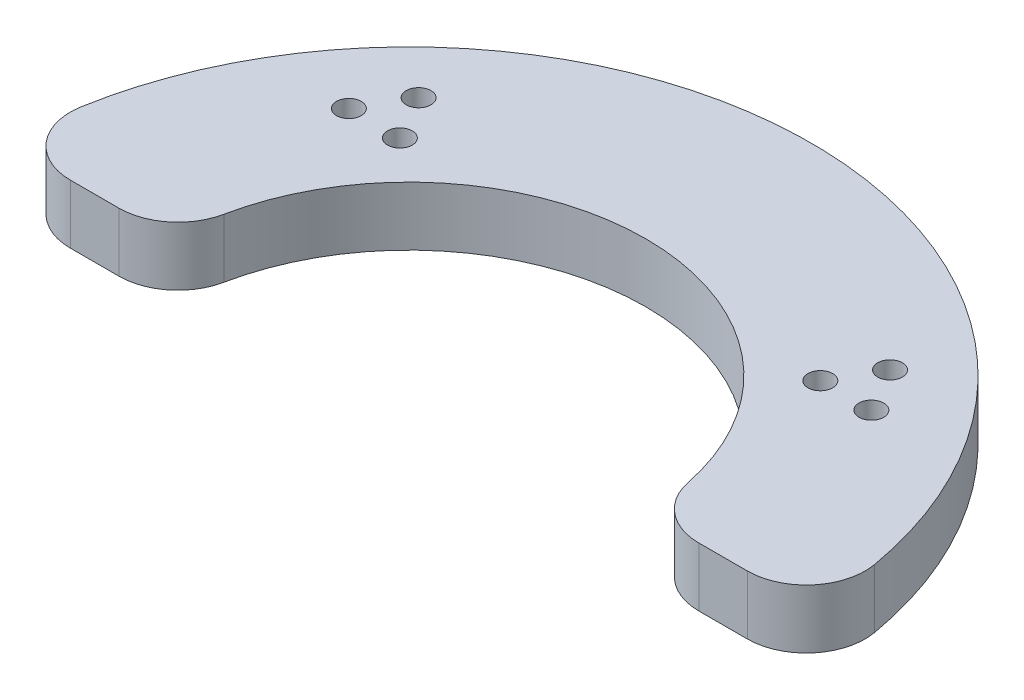
ISO-10303-21;
HEADER;
FILE_DESCRIPTION(('STEP AP214'),'2;1');
FILE_NAME('part.step','',(''),(''),'','','');
FILE_SCHEMA(('AUTOMOTIVE_DESIGN { 1 0 10303 214 1 1 1 1 }'));
ENDSEC;
DATA;
#1=APPLICATION_CONTEXT('core data for automotive mechanical design processes');
#2=APPLICATION_PROTOCOL_DEFINITION('international standard','automotive_design',2000,#1);
#3=PRODUCT_CONTEXT('',#1,'mechanical');
#4=PRODUCT('Part','Part','',(#3));
#5=PRODUCT_RELATED_PRODUCT_CATEGORY('part','',(#4));
#6=PRODUCT_DEFINITION_FORMATION('','',#4);
#7=PRODUCT_DEFINITION_CONTEXT('part definition',#1,'design');
#8=PRODUCT_DEFINITION('design','',#6,#7);
#9=PRODUCT_DEFINITION_SHAPE('','',#8);
#10=(LENGTH_UNIT() NAMED_UNIT(*) SI_UNIT(.MILLI.,.METRE.));
#11=(NAMED_UNIT(*) PLANE_ANGLE_UNIT() SI_UNIT($,.RADIAN.));
#12=(NAMED_UNIT(*) SI_UNIT($,.STERADIAN.) SOLID_ANGLE_UNIT());
#13=UNCERTAINTY_MEASURE_WITH_UNIT(LENGTH_MEASURE(1.E-05),#10,'distance_accuracy_value','');
#14=(GEOMETRIC_REPRESENTATION_CONTEXT(3) GLOBAL_UNCERTAINTY_ASSIGNED_CONTEXT((#13)) GLOBAL_UNIT_ASSIGNED_CONTEXT((#10,
#11,#12)) REPRESENTATION_CONTEXT('',''));
#15=CARTESIAN_POINT('',(0.,0.,0.));
#16=DIRECTION('',(0.,0.,1.));
#17=DIRECTION('',(1.,0.,0.));
#18=AXIS2_PLACEMENT_3D('',#15,#16,#17);
#19=CARTESIAN_POINT('',(40.,10.,-36.6532469606971));
#20=DIRECTION('',(0.,-1.,0.));
#21=DIRECTION('',(0.,0.,-1.));
#22=AXIS2_PLACEMENT_3D('',#19,#20,#21);
#23=CYLINDRICAL_SURFACE('',#22,10.05);
#24=CARTESIAN_POINT('',(40.,0.,-36.6532469606971));
#25=DIRECTION('',(0.,1.,0.));
#26=DIRECTION('',(0.,0.,1.));
#27=AXIS2_PLACEMENT_3D('',#24,#25,#26);
#28=CIRCLE('',#27,10.05);
#29=CARTESIAN_POINT('',(40.,0.,-26.6032469606971));
#30=VERTEX_POINT('',#29);
#31=EDGE_CURVE('E176',#30,#30,#28,.T.);
#32=ORIENTED_EDGE('',*,*,#31,.F.);
#33=EDGE_LOOP('',(#32));
#34=FACE_BOUND('',#33,.T.);
#35=CARTESIAN_POINT('',(40.,5.,-36.6532469606971));
#36=DIRECTION('',(0.,1.,0.));
#37=DIRECTION('',(0.,0.,1.));
#38=AXIS2_PLACEMENT_3D('',#35,#36,#37);
#39=CIRCLE('',#38,10.05);
#40=CARTESIAN_POINT('',(40.,5.,-26.6032469606971));
#41=VERTEX_POINT('',#40);
#42=EDGE_CURVE('E164',#41,#41,#39,.T.);
#43=ORIENTED_EDGE('',*,*,#42,.T.);
#44=EDGE_LOOP('',(#43));
#45=FACE_BOUND('',#44,.T.);
#46=ADVANCED_FACE('F35',(#34,#45),#23,.F.);
#47=CARTESIAN_POINT('',(-40.,10.,-36.6532469606971));
#48=DIRECTION('',(0.,-1.,0.));
#49=DIRECTION('',(0.,0.,-1.));
#50=AXIS2_PLACEMENT_3D('',#47,#48,#49);
#51=CYLINDRICAL_SURFACE('',#50,10.05);
#52=CARTESIAN_POINT('',(-40.,0.,-36.6532469606971));
#53=DIRECTION('',(0.,1.,0.));
#54=DIRECTION('',(0.,0.,-1.));
#55=AXIS2_PLACEMENT_3D('',#52,#53,#54);
#56=CIRCLE('',#55,10.05);
#57=CARTESIAN_POINT('',(-40.,0.,-46.7032469606971));
#58=VERTEX_POINT('',#57);
#59=EDGE_CURVE('E170',#58,#58,#56,.T.);
#60=ORIENTED_EDGE('',*,*,#59,.F.);
#61=EDGE_LOOP('',(#60));
#62=FACE_BOUND('',#61,.T.);
#63=CARTESIAN_POINT('',(-40.,5.,-36.6532469606971));
#64=DIRECTION('',(0.,1.,0.));
#65=DIRECTION('',(0.,0.,1.));
#66=AXIS2_PLACEMENT_3D('',#63,#64,#65);
#67=CIRCLE('',#66,10.05);
#68=CARTESIAN_POINT('',(-40.,5.,-26.6032469606971));
#69=VERTEX_POINT('',#68);
#70=EDGE_CURVE('E167',#69,#69,#67,.T.);
#71=ORIENTED_EDGE('',*,*,#70,.T.);
#72=EDGE_LOOP('',(#71));
#73=FACE_BOUND('',#72,.T.);
#74=ADVANCED_FACE('F206',(#62,#73),#51,.F.);
#75=CARTESIAN_POINT('',(0.,10.,0.));
#76=DIRECTION('',(0.,1.,0.));
#77=DIRECTION('',(0.,0.,1.));
#78=AXIS2_PLACEMENT_3D('',#75,#76,#77);
#79=PLANE('',#78);
#80=CARTESIAN_POINT('',(-40.,10.,-41.6532469606971));
#81=DIRECTION('',(0.,1.,0.));
#82=DIRECTION('',(0.,0.,1.));
#83=AXIS2_PLACEMENT_3D('',#80,#81,#82);
#84=CIRCLE('',#83,2.1);
#85=CARTESIAN_POINT('',(-40.,10.,-39.5532469606971));
#86=VERTEX_POINT('',#85);
#87=EDGE_CURVE('E294',#86,#86,#84,.F.);
#88=ORIENTED_EDGE('',*,*,#87,.T.);
#89=EDGE_LOOP('',(#88));
#90=FACE_BOUND('',#89,.T.);
#91=CARTESIAN_POINT('',(-35.6698729810778,10.,-34.1532469606971));
#92=DIRECTION('',(0.,1.,0.));
#93=DIRECTION('',(0.,0.,1.));
#94=AXIS2_PLACEMENT_3D('',#91,#92,#93);
#95=CIRCLE('',#94,2.1);
#96=CARTESIAN_POINT('',(-35.6698729810778,10.,-32.0532469606971));
#97=VERTEX_POINT('',#96);
#98=EDGE_CURVE('E291',#97,#97,#95,.F.);
#99=ORIENTED_EDGE('',*,*,#98,.T.);
#100=EDGE_LOOP('',(#99));
#101=FACE_BOUND('',#100,.T.);
#102=CARTESIAN_POINT('',(-44.3301270189222,10.,-34.1532469606971));
#103=DIRECTION('',(0.,1.,0.));
#104=DIRECTION('',(0.,0.,1.));
#105=AXIS2_PLACEMENT_3D('',#102,#103,#104);
#106=CIRCLE('',#105,2.1);
#107=CARTESIAN_POINT('',(-44.3301270189222,10.,-32.0532469606971));
#108=VERTEX_POINT('',#107);
#109=EDGE_CURVE('E288',#108,#108,#106,.F.);
#110=ORIENTED_EDGE('',*,*,#109,.T.);
#111=EDGE_LOOP('',(#110));
#112=FACE_BOUND('',#111,.T.);
#113=CARTESIAN_POINT('',(40.,10.,-41.6532469606971));
#114=DIRECTION('',(0.,1.,0.));
#115=DIRECTION('',(0.,0.,1.));
#116=AXIS2_PLACEMENT_3D('',#113,#114,#115);
#117=CIRCLE('',#116,2.1);
#118=CARTESIAN_POINT('',(40.,10.,-39.5532469606971));
#119=VERTEX_POINT('',#118);
#120=EDGE_CURVE('E153',#119,#119,#117,.T.);
#121=ORIENTED_EDGE('',*,*,#120,.F.);
#122=EDGE_LOOP('',(#121));
#123=FACE_BOUND('',#122,.T.);
#124=CARTESIAN_POINT('',(35.6698729810778,10.,-34.1532469606971));
#125=DIRECTION('',(0.,1.,0.));
#126=DIRECTION('',(0.,0.,1.));
#127=AXIS2_PLACEMENT_3D('',#124,#125,#126);
#128=CIRCLE('',#127,2.1);
#129=CARTESIAN_POINT('',(35.6698729810778,10.,-32.0532469606971));
#130=VERTEX_POINT('',#129);
#131=EDGE_CURVE('E158',#130,#130,#128,.T.);
#132=ORIENTED_EDGE('',*,*,#131,.F.);
#133=EDGE_LOOP('',(#132));
#134=FACE_BOUND('',#133,.T.);
#135=CARTESIAN_POINT('',(44.3301270189222,10.,-34.1532469606971));
#136=DIRECTION('',(0.,1.,0.));
#137=DIRECTION('',(0.,0.,1.));
#138=AXIS2_PLACEMENT_3D('',#135,#136,#137);
#139=CIRCLE('',#138,2.1);
#140=CARTESIAN_POINT('',(44.3301270189222,10.,-32.0532469606971));
#141=VERTEX_POINT('',#140);
#142=EDGE_CURVE('E301',#141,#141,#139,.T.);
#143=ORIENTED_EDGE('',*,*,#142,.F.);
#144=EDGE_LOOP('',(#143));
#145=FACE_BOUND('',#144,.T.);
#146=CARTESIAN_POINT('',(0.,10.,0.));
#147=DIRECTION('',(0.,1.,0.));
#148=DIRECTION('',(0.,0.,1.));
#149=AXIS2_PLACEMENT_3D('',#146,#147,#148);
#150=CIRCLE('',#149,68.3036681963704);
#151=CARTESIAN_POINT('',(67.2915014195323,10.,-11.715157949637));
#152=VERTEX_POINT('',#151);
#153=CARTESIAN_POINT('',(-67.2915014195323,10.,-11.715157949637));
#154=VERTEX_POINT('',#153);
#155=EDGE_CURVE('E105',#152,#154,#150,.T.);
#156=ORIENTED_EDGE('',*,*,#155,.T.);
#157=CARTESIAN_POINT('',(-57.4396877180965,10.,-10.));
#158=DIRECTION('',(0.,1.,0.));
#159=DIRECTION('',(0.,0.,1.));
#160=AXIS2_PLACEMENT_3D('',#157,#158,#159);
#161=CIRCLE('',#160,10.);
#162=CARTESIAN_POINT('',(-57.4396877180965,10.,0.));
#163=VERTEX_POINT('',#162);
#164=EDGE_CURVE('E132',#154,#163,#161,.T.);
#165=ORIENTED_EDGE('',*,*,#164,.T.);
#166=DIRECTION('',(-1.,0.,0.));
#167=VECTOR('',#166,1.);
#168=CARTESIAN_POINT('',(0.,10.,0.));
#169=LINE('',#168,#167);
#170=CARTESIAN_POINT('',(-49.1976452726271,10.,0.));
#171=VERTEX_POINT('',#170);
#172=EDGE_CURVE('E156',#171,#163,#169,.T.);
#173=ORIENTED_EDGE('',*,*,#172,.F.);
#174=CARTESIAN_POINT('',(-49.1976452726271,10.,-10.));
#175=DIRECTION('',(0.,1.,0.));
#176=DIRECTION('',(0.,0.,1.));
#177=AXIS2_PLACEMENT_3D('',#174,#175,#176);
#178=CIRCLE('',#177,10.);
#179=CARTESIAN_POINT('',(-39.3980336027803,10.,-8.00811367789197));
#180=VERTEX_POINT('',#179);
#181=EDGE_CURVE('E130',#171,#180,#178,.T.);
#182=ORIENTED_EDGE('',*,*,#181,.T.);
#183=CARTESIAN_POINT('',(0.,10.,0.));
#184=DIRECTION('',(0.,1.,0.));
#185=DIRECTION('',(0.,0.,1.));
#186=AXIS2_PLACEMENT_3D('',#183,#184,#185);
#187=CIRCLE('',#186,40.2036681963704);
#188=CARTESIAN_POINT('',(39.3980336027803,10.,-8.00811367789197));
#189=VERTEX_POINT('',#188);
#190=EDGE_CURVE('E174',#189,#180,#187,.T.);
#191=ORIENTED_EDGE('',*,*,#190,.F.);
#192=CARTESIAN_POINT('',(49.1976452726271,10.,-10.));
#193=DIRECTION('',(0.,1.,0.));
#194=DIRECTION('',(0.,0.,1.));
#195=AXIS2_PLACEMENT_3D('',#192,#193,#194);
#196=CIRCLE('',#195,10.);
#197=CARTESIAN_POINT('',(49.1976452726271,10.,0.));
#198=VERTEX_POINT('',#197);
#199=EDGE_CURVE('E111',#189,#198,#196,.T.);
#200=ORIENTED_EDGE('',*,*,#199,.T.);
#201=CARTESIAN_POINT('',(57.4396877180965,10.,0.));
#202=VERTEX_POINT('',#201);
#203=EDGE_CURVE('E107',#202,#198,#169,.T.);
#204=ORIENTED_EDGE('',*,*,#203,.F.);
#205=CARTESIAN_POINT('',(57.4396877180965,10.,-10.));
#206=DIRECTION('',(0.,1.,0.));
#207=DIRECTION('',(0.,0.,1.));
#208=AXIS2_PLACEMENT_3D('',#205,#206,#207);
#209=CIRCLE('',#208,10.);
#210=EDGE_CURVE('E102',#202,#152,#209,.T.);
#211=ORIENTED_EDGE('',*,*,#210,.T.);
#212=EDGE_LOOP('',(#156,#165,#173,#182,#191,#200,#204,#211));
#213=FACE_BOUND('',#212,.T.);
#214=ADVANCED_FACE('F104',(#90,#101,#112,#123,#134,#145,#213),#79,.T.);
#215=CARTESIAN_POINT('',(0.,0.,0.));
#216=DIRECTION('',(0.,1.,0.));
#217=DIRECTION('',(0.,0.,1.));
#218=AXIS2_PLACEMENT_3D('',#215,#216,#217);
#219=PLANE('',#218);
#220=ORIENTED_EDGE('',*,*,#31,.T.);
#221=EDGE_LOOP('',(#220));
#222=FACE_BOUND('',#221,.T.);
#223=DIRECTION('',(1.,0.,0.));
#224=VECTOR('',#223,1.);
#225=CARTESIAN_POINT('',(132.868809524425,0.,0.));
#226=LINE('',#225,#224);
#227=CARTESIAN_POINT('',(-57.4396877180965,0.,0.));
#228=VERTEX_POINT('',#227);
#229=CARTESIAN_POINT('',(-49.1976452726272,0.,0.));
#230=VERTEX_POINT('',#229);
#231=EDGE_CURVE('E152',#228,#230,#226,.T.);
#232=ORIENTED_EDGE('',*,*,#231,.F.);
#233=CARTESIAN_POINT('',(-57.4396877180965,0.,-10.));
#234=DIRECTION('',(0.,1.,0.));
#235=DIRECTION('',(0.,0.,1.));
#236=AXIS2_PLACEMENT_3D('',#233,#234,#235);
#237=CIRCLE('',#236,10.);
#238=CARTESIAN_POINT('',(-67.2915014195323,0.,-11.715157949637));
#239=VERTEX_POINT('',#238);
#240=EDGE_CURVE('E143',#228,#239,#237,.F.);
#241=ORIENTED_EDGE('',*,*,#240,.T.);
#242=CARTESIAN_POINT('',(0.,0.,0.));
#243=DIRECTION('',(0.,1.,0.));
#244=DIRECTION('',(0.,0.,1.));
#245=AXIS2_PLACEMENT_3D('',#242,#243,#244);
#246=CIRCLE('',#245,68.3036681963704);
#247=CARTESIAN_POINT('',(67.2915014195323,0.,-11.715157949637));
#248=VERTEX_POINT('',#247);
#249=EDGE_CURVE('E122',#248,#239,#246,.T.);
#250=ORIENTED_EDGE('',*,*,#249,.F.);
#251=CARTESIAN_POINT('',(57.4396877180965,0.,-10.));
#252=DIRECTION('',(0.,1.,0.));
#253=DIRECTION('',(0.,0.,1.));
#254=AXIS2_PLACEMENT_3D('',#251,#252,#253);
#255=CIRCLE('',#254,10.);
#256=CARTESIAN_POINT('',(57.4396877180965,0.,0.));
#257=VERTEX_POINT('',#256);
#258=EDGE_CURVE('E124',#248,#257,#255,.F.);
#259=ORIENTED_EDGE('',*,*,#258,.T.);
#260=CARTESIAN_POINT('',(49.1976452726271,0.,0.));
#261=VERTEX_POINT('',#260);
#262=EDGE_CURVE('E151',#261,#257,#226,.T.);
#263=ORIENTED_EDGE('',*,*,#262,.F.);
#264=CARTESIAN_POINT('',(49.1976452726271,0.,-10.));
#265=DIRECTION('',(0.,1.,0.));
#266=DIRECTION('',(0.,0.,1.));
#267=AXIS2_PLACEMENT_3D('',#264,#265,#266);
#268=CIRCLE('',#267,10.);
#269=CARTESIAN_POINT('',(39.3980336027803,0.,-8.00811367789197));
#270=VERTEX_POINT('',#269);
#271=EDGE_CURVE('E57',#261,#270,#268,.F.);
#272=ORIENTED_EDGE('',*,*,#271,.T.);
#273=CARTESIAN_POINT('',(0.,0.,0.));
#274=DIRECTION('',(0.,1.,0.));
#275=DIRECTION('',(0.,0.,1.));
#276=AXIS2_PLACEMENT_3D('',#273,#274,#275);
#277=CIRCLE('',#276,40.2036681963704);
#278=CARTESIAN_POINT('',(-39.3980336027803,0.,-8.00811367789197));
#279=VERTEX_POINT('',#278);
#280=EDGE_CURVE('E173',#270,#279,#277,.T.);
#281=ORIENTED_EDGE('',*,*,#280,.T.);
#282=CARTESIAN_POINT('',(-49.1976452726271,0.,-10.));
#283=DIRECTION('',(0.,1.,0.));
#284=DIRECTION('',(0.,0.,1.));
#285=AXIS2_PLACEMENT_3D('',#282,#283,#284);
#286=CIRCLE('',#285,10.);
#287=EDGE_CURVE('E141',#279,#230,#286,.F.);
#288=ORIENTED_EDGE('',*,*,#287,.T.);
#289=EDGE_LOOP('',(#232,#241,#250,#259,#263,#272,#281,#288));
#290=FACE_BOUND('',#289,.T.);
#291=ORIENTED_EDGE('',*,*,#59,.T.);
#292=EDGE_LOOP('',(#291));
#293=FACE_BOUND('',#292,.T.);
#294=ADVANCED_FACE('F219',(#222,#290,#293),#219,.F.);
#295=CARTESIAN_POINT('',(0.,10.,0.));
#296=DIRECTION('',(0.,-1.,0.));
#297=DIRECTION('',(0.,0.,-1.));
#298=AXIS2_PLACEMENT_3D('',#295,#296,#297);
#299=CYLINDRICAL_SURFACE('',#298,68.3036681963704);
#300=ORIENTED_EDGE('',*,*,#249,.T.);
#301=DIRECTION('',(0.,-1.,0.));
#302=VECTOR('',#301,1.);
#303=CARTESIAN_POINT('',(-67.2915014195323,10.,-11.715157949637));
#304=LINE('',#303,#302);
#305=EDGE_CURVE('E112',#239,#154,#304,.F.);
#306=ORIENTED_EDGE('',*,*,#305,.T.);
#307=ORIENTED_EDGE('',*,*,#155,.F.);
#308=DIRECTION('',(0.,-1.,0.));
#309=VECTOR('',#308,1.);
#310=CARTESIAN_POINT('',(67.2915014195323,10.,-11.715157949637));
#311=LINE('',#310,#309);
#312=EDGE_CURVE('E119',#152,#248,#311,.T.);
#313=ORIENTED_EDGE('',*,*,#312,.T.);
#314=EDGE_LOOP('',(#300,#306,#307,#313));
#315=FACE_BOUND('',#314,.T.);
#316=ADVANCED_FACE('F118',(#315),#299,.T.);
#317=CARTESIAN_POINT('',(0.,10.,0.));
#318=DIRECTION('',(0.,-1.,0.));
#319=DIRECTION('',(0.,0.,-1.));
#320=AXIS2_PLACEMENT_3D('',#317,#318,#319);
#321=CYLINDRICAL_SURFACE('',#320,40.2036681963704);
#322=ORIENTED_EDGE('',*,*,#190,.T.);
#323=DIRECTION('',(0.,-1.,0.));
#324=VECTOR('',#323,1.);
#325=CARTESIAN_POINT('',(-39.3980336027803,10.,-8.00811367789197));
#326=LINE('',#325,#324);
#327=EDGE_CURVE('E50',#180,#279,#326,.T.);
#328=ORIENTED_EDGE('',*,*,#327,.T.);
#329=ORIENTED_EDGE('',*,*,#280,.F.);
#330=DIRECTION('',(0.,-1.,0.));
#331=VECTOR('',#330,1.);
#332=CARTESIAN_POINT('',(39.3980336027803,10.,-8.00811367789197));
#333=LINE('',#332,#331);
#334=EDGE_CURVE('E145',#270,#189,#333,.F.);
#335=ORIENTED_EDGE('',*,*,#334,.T.);
#336=EDGE_LOOP('',(#322,#328,#329,#335));
#337=FACE_BOUND('',#336,.T.);
#338=ADVANCED_FACE('F195',(#337),#321,.F.);
#339=CARTESIAN_POINT('',(-40.,5.,-36.6532469606971));
#340=DIRECTION('',(0.,1.,0.));
#341=DIRECTION('',(0.,0.,1.));
#342=AXIS2_PLACEMENT_3D('',#339,#340,#341);
#343=PLANE('',#342);
#344=CARTESIAN_POINT('',(-40.,5.,-41.6532469606971));
#345=DIRECTION('',(0.,1.,0.));
#346=DIRECTION('',(0.,0.,-1.));
#347=AXIS2_PLACEMENT_3D('',#344,#345,#346);
#348=CIRCLE('',#347,2.1);
#349=CARTESIAN_POINT('',(-40.,5.,-43.7532469606971));
#350=VERTEX_POINT('',#349);
#351=EDGE_CURVE('E272',#350,#350,#348,.T.);
#352=ORIENTED_EDGE('',*,*,#351,.T.);
#353=EDGE_LOOP('',(#352));
#354=FACE_BOUND('',#353,.T.);
#355=CARTESIAN_POINT('',(-35.6698729810778,5.,-34.1532469606971));
#356=DIRECTION('',(0.,1.,0.));
#357=DIRECTION('',(0.,0.,-1.));
#358=AXIS2_PLACEMENT_3D('',#355,#356,#357);
#359=CIRCLE('',#358,2.1);
#360=CARTESIAN_POINT('',(-35.6698729810778,5.,-36.2532469606971));
#361=VERTEX_POINT('',#360);
#362=EDGE_CURVE('E276',#361,#361,#359,.T.);
#363=ORIENTED_EDGE('',*,*,#362,.T.);
#364=EDGE_LOOP('',(#363));
#365=FACE_BOUND('',#364,.T.);
#366=CARTESIAN_POINT('',(-44.3301270189222,5.,-34.1532469606971));
#367=DIRECTION('',(0.,1.,0.));
#368=DIRECTION('',(0.,0.,-1.));
#369=AXIS2_PLACEMENT_3D('',#366,#367,#368);
#370=CIRCLE('',#369,2.1);
#371=CARTESIAN_POINT('',(-44.3301270189222,5.,-36.2532469606971));
#372=VERTEX_POINT('',#371);
#373=EDGE_CURVE('E280',#372,#372,#370,.T.);
#374=ORIENTED_EDGE('',*,*,#373,.T.);
#375=EDGE_LOOP('',(#374));
#376=FACE_BOUND('',#375,.T.);
#377=ORIENTED_EDGE('',*,*,#70,.F.);
#378=EDGE_LOOP('',(#377));
#379=FACE_BOUND('',#378,.T.);
#380=ADVANCED_FACE('F262',(#354,#365,#376,#379),#343,.F.);
#381=CARTESIAN_POINT('',(40.,5.,-36.6532469606971));
#382=DIRECTION('',(0.,1.,0.));
#383=DIRECTION('',(0.,0.,1.));
#384=AXIS2_PLACEMENT_3D('',#381,#382,#383);
#385=PLANE('',#384);
#386=CARTESIAN_POINT('',(40.,5.,-41.6532469606971));
#387=DIRECTION('',(0.,-1.,0.));
#388=DIRECTION('',(0.,0.,-1.));
#389=AXIS2_PLACEMENT_3D('',#386,#387,#388);
#390=CIRCLE('',#389,2.1);
#391=CARTESIAN_POINT('',(40.,5.,-43.7532469606971));
#392=VERTEX_POINT('',#391);
#393=EDGE_CURVE('E298',#392,#392,#390,.T.);
#394=ORIENTED_EDGE('',*,*,#393,.F.);
#395=EDGE_LOOP('',(#394));
#396=FACE_BOUND('',#395,.T.);
#397=CARTESIAN_POINT('',(35.6698729810778,5.,-34.1532469606971));
#398=DIRECTION('',(0.,-1.,0.));
#399=DIRECTION('',(0.,0.,-1.));
#400=AXIS2_PLACEMENT_3D('',#397,#398,#399);
#401=CIRCLE('',#400,2.1);
#402=CARTESIAN_POINT('',(35.6698729810778,5.,-36.2532469606971));
#403=VERTEX_POINT('',#402);
#404=EDGE_CURVE('E302',#403,#403,#401,.T.);
#405=ORIENTED_EDGE('',*,*,#404,.F.);
#406=EDGE_LOOP('',(#405));
#407=FACE_BOUND('',#406,.T.);
#408=CARTESIAN_POINT('',(44.3301270189222,5.,-34.1532469606971));
#409=DIRECTION('',(0.,-1.,0.));
#410=DIRECTION('',(0.,0.,-1.));
#411=AXIS2_PLACEMENT_3D('',#408,#409,#410);
#412=CIRCLE('',#411,2.1);
#413=CARTESIAN_POINT('',(44.3301270189222,5.,-36.2532469606971));
#414=VERTEX_POINT('',#413);
#415=EDGE_CURVE('E297',#414,#414,#412,.T.);
#416=ORIENTED_EDGE('',*,*,#415,.F.);
#417=EDGE_LOOP('',(#416));
#418=FACE_BOUND('',#417,.T.);
#419=ORIENTED_EDGE('',*,*,#42,.F.);
#420=EDGE_LOOP('',(#419));
#421=FACE_BOUND('',#420,.T.);
#422=ADVANCED_FACE('F259',(#396,#407,#418,#421),#385,.F.);
#423=CARTESIAN_POINT('',(132.868809524425,45.,0.));
#424=DIRECTION('',(0.,0.,-1.));
#425=DIRECTION('',(-1.,0.,0.));
#426=AXIS2_PLACEMENT_3D('',#423,#424,#425);
#427=PLANE('',#426);
#428=ORIENTED_EDGE('',*,*,#172,.T.);
#429=DIRECTION('',(0.,-1.,0.));
#430=VECTOR('',#429,1.);
#431=CARTESIAN_POINT('',(-57.4396877180965,45.,0.));
#432=LINE('',#431,#430);
#433=EDGE_CURVE('E137',#163,#228,#432,.T.);
#434=ORIENTED_EDGE('',*,*,#433,.T.);
#435=ORIENTED_EDGE('',*,*,#231,.T.);
#436=DIRECTION('',(0.,1.,0.));
#437=VECTOR('',#436,1.);
#438=CARTESIAN_POINT('',(-49.1976452726271,10.,0.));
#439=LINE('',#438,#437);
#440=EDGE_CURVE('E134',#230,#171,#439,.T.);
#441=ORIENTED_EDGE('',*,*,#440,.T.);
#442=EDGE_LOOP('',(#428,#434,#435,#441));
#443=FACE_BOUND('',#442,.T.);
#444=ADVANCED_FACE('F187',(#443),#427,.F.);
#445=ORIENTED_EDGE('',*,*,#203,.T.);
#446=DIRECTION('',(0.,1.,0.));
#447=VECTOR('',#446,1.);
#448=CARTESIAN_POINT('',(49.1976452726271,0.,0.));
#449=LINE('',#448,#447);
#450=EDGE_CURVE('E11',#198,#261,#449,.F.);
#451=ORIENTED_EDGE('',*,*,#450,.T.);
#452=ORIENTED_EDGE('',*,*,#262,.T.);
#453=DIRECTION('',(0.,-1.,0.));
#454=VECTOR('',#453,1.);
#455=CARTESIAN_POINT('',(57.4396877180965,45.,0.));
#456=LINE('',#455,#454);
#457=EDGE_CURVE('E43',#257,#202,#456,.F.);
#458=ORIENTED_EDGE('',*,*,#457,.T.);
#459=EDGE_LOOP('',(#445,#451,#452,#458));
#460=FACE_BOUND('',#459,.T.);
#461=ADVANCED_FACE('F149',(#460),#427,.F.);
#462=CARTESIAN_POINT('',(44.3301270189222,50.,-34.1532469606971));
#463=DIRECTION('',(0.,-1.,0.));
#464=DIRECTION('',(0.,0.,-1.));
#465=AXIS2_PLACEMENT_3D('',#462,#463,#464);
#466=CYLINDRICAL_SURFACE('',#465,2.1);
#467=ORIENTED_EDGE('',*,*,#142,.T.);
#468=EDGE_LOOP('',(#467));
#469=FACE_BOUND('',#468,.T.);
#470=ORIENTED_EDGE('',*,*,#415,.T.);
#471=EDGE_LOOP('',(#470));
#472=FACE_BOUND('',#471,.T.);
#473=ADVANCED_FACE('F252',(#469,#472),#466,.F.);
#474=CARTESIAN_POINT('',(35.6698729810778,50.,-34.1532469606971));
#475=DIRECTION('',(0.,-1.,0.));
#476=DIRECTION('',(0.,0.,-1.));
#477=AXIS2_PLACEMENT_3D('',#474,#475,#476);
#478=CYLINDRICAL_SURFACE('',#477,2.1);
#479=ORIENTED_EDGE('',*,*,#131,.T.);
#480=EDGE_LOOP('',(#479));
#481=FACE_BOUND('',#480,.T.);
#482=ORIENTED_EDGE('',*,*,#404,.T.);
#483=EDGE_LOOP('',(#482));
#484=FACE_BOUND('',#483,.T.);
#485=ADVANCED_FACE('F248',(#481,#484),#478,.F.);
#486=CARTESIAN_POINT('',(40.,50.,-41.6532469606971));
#487=DIRECTION('',(0.,-1.,0.));
#488=DIRECTION('',(0.,0.,-1.));
#489=AXIS2_PLACEMENT_3D('',#486,#487,#488);
#490=CYLINDRICAL_SURFACE('',#489,2.1);
#491=ORIENTED_EDGE('',*,*,#120,.T.);
#492=EDGE_LOOP('',(#491));
#493=FACE_BOUND('',#492,.T.);
#494=ORIENTED_EDGE('',*,*,#393,.T.);
#495=EDGE_LOOP('',(#494));
#496=FACE_BOUND('',#495,.T.);
#497=ADVANCED_FACE('F244',(#493,#496),#490,.F.);
#498=CARTESIAN_POINT('',(-44.3301270189222,50.,-34.1532469606971));
#499=DIRECTION('',(0.,-1.,0.));
#500=DIRECTION('',(0.,0.,-1.));
#501=AXIS2_PLACEMENT_3D('',#498,#499,#500);
#502=CYLINDRICAL_SURFACE('',#501,2.1);
#503=ORIENTED_EDGE('',*,*,#109,.F.);
#504=EDGE_LOOP('',(#503));
#505=FACE_BOUND('',#504,.T.);
#506=ORIENTED_EDGE('',*,*,#373,.F.);
#507=EDGE_LOOP('',(#506));
#508=FACE_BOUND('',#507,.T.);
#509=ADVANCED_FACE('F236',(#505,#508),#502,.F.);
#510=CARTESIAN_POINT('',(-35.6698729810778,50.,-34.1532469606971));
#511=DIRECTION('',(0.,-1.,0.));
#512=DIRECTION('',(0.,0.,-1.));
#513=AXIS2_PLACEMENT_3D('',#510,#511,#512);
#514=CYLINDRICAL_SURFACE('',#513,2.1);
#515=ORIENTED_EDGE('',*,*,#98,.F.);
#516=EDGE_LOOP('',(#515));
#517=FACE_BOUND('',#516,.T.);
#518=ORIENTED_EDGE('',*,*,#362,.F.);
#519=EDGE_LOOP('',(#518));
#520=FACE_BOUND('',#519,.T.);
#521=ADVANCED_FACE('F230',(#517,#520),#514,.F.);
#522=CARTESIAN_POINT('',(-40.,50.,-41.6532469606971));
#523=DIRECTION('',(0.,-1.,0.));
#524=DIRECTION('',(0.,0.,-1.));
#525=AXIS2_PLACEMENT_3D('',#522,#523,#524);
#526=CYLINDRICAL_SURFACE('',#525,2.1);
#527=ORIENTED_EDGE('',*,*,#87,.F.);
#528=EDGE_LOOP('',(#527));
#529=FACE_BOUND('',#528,.T.);
#530=ORIENTED_EDGE('',*,*,#351,.F.);
#531=EDGE_LOOP('',(#530));
#532=FACE_BOUND('',#531,.T.);
#533=ADVANCED_FACE('F226',(#529,#532),#526,.F.);
#534=CARTESIAN_POINT('',(-57.4396877180965,10.,-10.));
#535=DIRECTION('',(0.,-1.,0.));
#536=DIRECTION('',(0.,0.,-1.));
#537=AXIS2_PLACEMENT_3D('',#534,#535,#536);
#538=CYLINDRICAL_SURFACE('',#537,10.);
#539=ORIENTED_EDGE('',*,*,#240,.F.);
#540=ORIENTED_EDGE('',*,*,#433,.F.);
#541=ORIENTED_EDGE('',*,*,#164,.F.);
#542=ORIENTED_EDGE('',*,*,#305,.F.);
#543=EDGE_LOOP('',(#539,#540,#541,#542));
#544=FACE_BOUND('',#543,.T.);
#545=ADVANCED_FACE('F183',(#544),#538,.T.);
#546=CARTESIAN_POINT('',(-49.1976452726271,10.,-10.));
#547=DIRECTION('',(0.,-1.,0.));
#548=DIRECTION('',(0.,0.,-1.));
#549=AXIS2_PLACEMENT_3D('',#546,#547,#548);
#550=CYLINDRICAL_SURFACE('',#549,10.);
#551=ORIENTED_EDGE('',*,*,#287,.F.);
#552=ORIENTED_EDGE('',*,*,#327,.F.);
#553=ORIENTED_EDGE('',*,*,#181,.F.);
#554=ORIENTED_EDGE('',*,*,#440,.F.);
#555=EDGE_LOOP('',(#551,#552,#553,#554));
#556=FACE_BOUND('',#555,.T.);
#557=ADVANCED_FACE('F192',(#556),#550,.T.);
#558=CARTESIAN_POINT('',(49.1976452726271,10.,-10.));
#559=DIRECTION('',(0.,-1.,0.));
#560=DIRECTION('',(0.,0.,-1.));
#561=AXIS2_PLACEMENT_3D('',#558,#559,#560);
#562=CYLINDRICAL_SURFACE('',#561,10.);
#563=ORIENTED_EDGE('',*,*,#199,.F.);
#564=ORIENTED_EDGE('',*,*,#334,.F.);
#565=ORIENTED_EDGE('',*,*,#271,.F.);
#566=ORIENTED_EDGE('',*,*,#450,.F.);
#567=EDGE_LOOP('',(#563,#564,#565,#566));
#568=FACE_BOUND('',#567,.T.);
#569=ADVANCED_FACE('F198',(#568),#562,.T.);
#570=CARTESIAN_POINT('',(57.4396877180965,10.,-10.));
#571=DIRECTION('',(0.,-1.,0.));
#572=DIRECTION('',(0.,0.,-1.));
#573=AXIS2_PLACEMENT_3D('',#570,#571,#572);
#574=CYLINDRICAL_SURFACE('',#573,10.);
#575=ORIENTED_EDGE('',*,*,#210,.F.);
#576=ORIENTED_EDGE('',*,*,#457,.F.);
#577=ORIENTED_EDGE('',*,*,#258,.F.);
#578=ORIENTED_EDGE('',*,*,#312,.F.);
#579=EDGE_LOOP('',(#575,#576,#577,#578));
#580=FACE_BOUND('',#579,.T.);
#581=ADVANCED_FACE('F37',(#580),#574,.T.);
#582=CLOSED_SHELL('',(#46,#74,#214,#294,#316,#338,#380,#422,#444,#461,#473,#485,#497,#509,#521,
#533,#545,#557,#569,#581));
#583=MANIFOLD_SOLID_BREP('B2',#582);
#584=ADVANCED_BREP_SHAPE_REPRESENTATION('',(#18,#583),#14);
#585=SHAPE_DEFINITION_REPRESENTATION(#9,#584);
ENDSEC;
END-ISO-10303-21;
